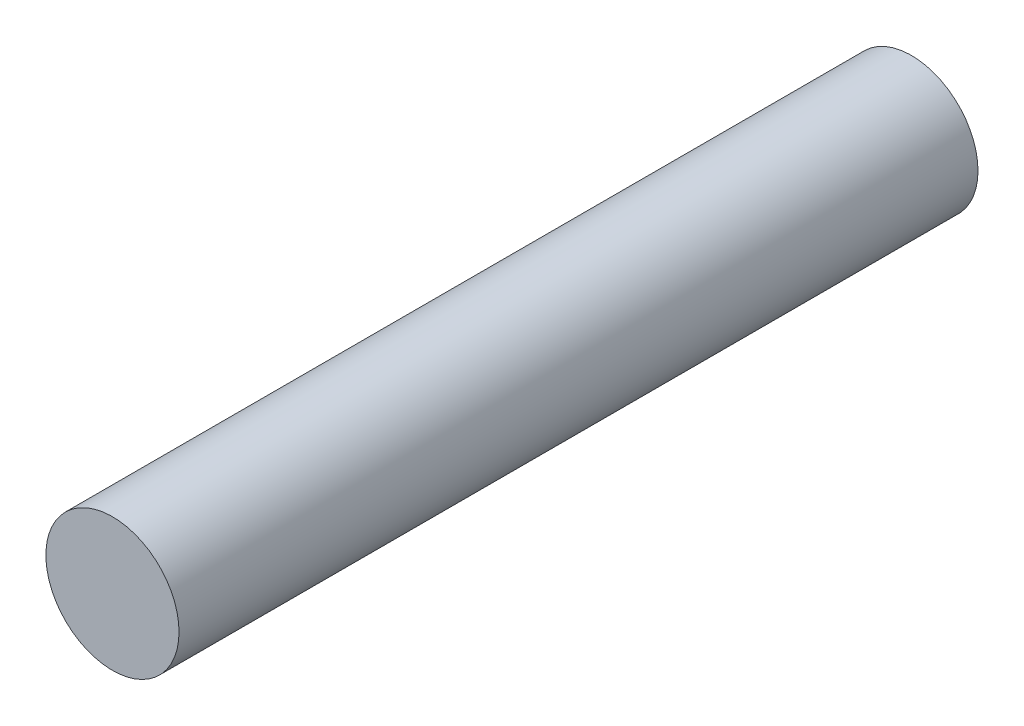
ISO-10303-21;
HEADER;
FILE_DESCRIPTION(('STEP AP214'),'2;1');
FILE_NAME('part.step','',(''),(''),'','','');
FILE_SCHEMA(('AUTOMOTIVE_DESIGN { 1 0 10303 214 1 1 1 1 }'));
ENDSEC;
DATA;
#1=APPLICATION_CONTEXT('core data for automotive mechanical design processes');
#2=APPLICATION_PROTOCOL_DEFINITION('international standard','automotive_design',2000,#1);
#3=PRODUCT_CONTEXT('',#1,'mechanical');
#4=PRODUCT('Part','Part','',(#3));
#5=PRODUCT_RELATED_PRODUCT_CATEGORY('part','',(#4));
#6=PRODUCT_DEFINITION_FORMATION('','',#4);
#7=PRODUCT_DEFINITION_CONTEXT('part definition',#1,'design');
#8=PRODUCT_DEFINITION('design','',#6,#7);
#9=PRODUCT_DEFINITION_SHAPE('','',#8);
#10=(LENGTH_UNIT() NAMED_UNIT(*) SI_UNIT(.MILLI.,.METRE.));
#11=(NAMED_UNIT(*) PLANE_ANGLE_UNIT() SI_UNIT($,.RADIAN.));
#12=(NAMED_UNIT(*) SI_UNIT($,.STERADIAN.) SOLID_ANGLE_UNIT());
#13=UNCERTAINTY_MEASURE_WITH_UNIT(LENGTH_MEASURE(1.E-05),#10,'distance_accuracy_value','');
#14=(GEOMETRIC_REPRESENTATION_CONTEXT(3) GLOBAL_UNCERTAINTY_ASSIGNED_CONTEXT((#13)) GLOBAL_UNIT_ASSIGNED_CONTEXT((#10,
#11,#12)) REPRESENTATION_CONTEXT('',''));
#15=CARTESIAN_POINT('',(0.,0.,0.));
#16=DIRECTION('',(0.,0.,1.));
#17=DIRECTION('',(1.,0.,0.));
#18=AXIS2_PLACEMENT_3D('',#15,#16,#17);
#19=CARTESIAN_POINT('',(0.,0.,150.));
#20=DIRECTION('',(0.,0.,-1.));
#21=DIRECTION('',(-1.,0.,0.));
#22=AXIS2_PLACEMENT_3D('',#19,#20,#21);
#23=CYLINDRICAL_SURFACE('',#22,12.5);
#24=CARTESIAN_POINT('',(0.,0.,150.));
#25=DIRECTION('',(0.,0.,1.));
#26=DIRECTION('',(1.,0.,0.));
#27=AXIS2_PLACEMENT_3D('',#24,#25,#26);
#28=CIRCLE('',#27,12.5);
#29=CARTESIAN_POINT('',(12.5,0.,150.));
#30=VERTEX_POINT('',#29);
#31=EDGE_CURVE('E10',#30,#30,#28,.T.);
#32=ORIENTED_EDGE('',*,*,#31,.F.);
#33=EDGE_LOOP('',(#32));
#34=FACE_BOUND('',#33,.T.);
#35=CARTESIAN_POINT('',(0.,0.,0.));
#36=DIRECTION('',(0.,0.,1.));
#37=DIRECTION('',(1.,0.,0.));
#38=AXIS2_PLACEMENT_3D('',#35,#36,#37);
#39=CIRCLE('',#38,12.5);
#40=CARTESIAN_POINT('',(12.5,0.,0.));
#41=VERTEX_POINT('',#40);
#42=EDGE_CURVE('E34',#41,#41,#39,.T.);
#43=ORIENTED_EDGE('',*,*,#42,.T.);
#44=EDGE_LOOP('',(#43));
#45=FACE_BOUND('',#44,.T.);
#46=ADVANCED_FACE('F31',(#34,#45),#23,.T.);
#47=CARTESIAN_POINT('',(0.,0.,150.));
#48=DIRECTION('',(0.,0.,1.));
#49=DIRECTION('',(1.,0.,0.));
#50=AXIS2_PLACEMENT_3D('',#47,#48,#49);
#51=PLANE('',#50);
#52=ORIENTED_EDGE('',*,*,#31,.T.);
#53=EDGE_LOOP('',(#52));
#54=FACE_BOUND('',#53,.T.);
#55=ADVANCED_FACE('F46',(#54),#51,.T.);
#56=CARTESIAN_POINT('',(0.,0.,0.));
#57=DIRECTION('',(0.,0.,1.));
#58=DIRECTION('',(1.,0.,0.));
#59=AXIS2_PLACEMENT_3D('',#56,#57,#58);
#60=PLANE('',#59);
#61=ORIENTED_EDGE('',*,*,#42,.F.);
#62=EDGE_LOOP('',(#61));
#63=FACE_BOUND('',#62,.T.);
#64=ADVANCED_FACE('F44',(#63),#60,.F.);
#65=CLOSED_SHELL('',(#46,#55,#64));
#66=MANIFOLD_SOLID_BREP('B2',#65);
#67=ADVANCED_BREP_SHAPE_REPRESENTATION('',(#18,#66),#14);
#68=SHAPE_DEFINITION_REPRESENTATION(#9,#67);
ENDSEC;
END-ISO-10303-21;
